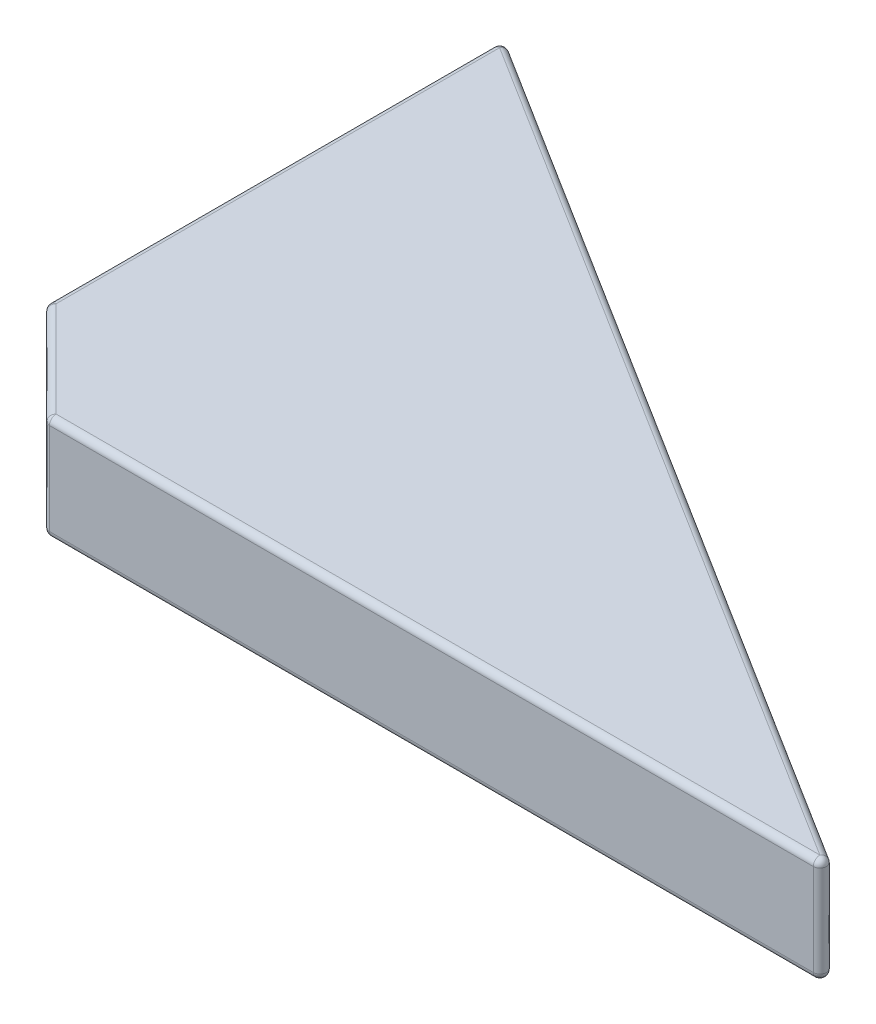
ISO-10303-21;
HEADER;
FILE_DESCRIPTION(('STEP AP214'),'2;1');
FILE_NAME('part.step','',(''),(''),'','','');
FILE_SCHEMA(('AUTOMOTIVE_DESIGN { 1 0 10303 214 1 1 1 1 }'));
ENDSEC;
DATA;
#1=APPLICATION_CONTEXT('core data for automotive mechanical design processes');
#2=APPLICATION_PROTOCOL_DEFINITION('international standard','automotive_design',2000,#1);
#3=PRODUCT_CONTEXT('',#1,'mechanical');
#4=PRODUCT('Part','Part','',(#3));
#5=PRODUCT_RELATED_PRODUCT_CATEGORY('part','',(#4));
#6=PRODUCT_DEFINITION_FORMATION('','',#4);
#7=PRODUCT_DEFINITION_CONTEXT('part definition',#1,'design');
#8=PRODUCT_DEFINITION('design','',#6,#7);
#9=PRODUCT_DEFINITION_SHAPE('','',#8);
#10=(LENGTH_UNIT() NAMED_UNIT(*) SI_UNIT(.MILLI.,.METRE.));
#11=(NAMED_UNIT(*) PLANE_ANGLE_UNIT() SI_UNIT($,.RADIAN.));
#12=(NAMED_UNIT(*) SI_UNIT($,.STERADIAN.) SOLID_ANGLE_UNIT());
#13=UNCERTAINTY_MEASURE_WITH_UNIT(LENGTH_MEASURE(1.E-05),#10,'distance_accuracy_value','');
#14=(GEOMETRIC_REPRESENTATION_CONTEXT(3) GLOBAL_UNCERTAINTY_ASSIGNED_CONTEXT((#13)) GLOBAL_UNIT_ASSIGNED_CONTEXT((#10,
#11,#12)) REPRESENTATION_CONTEXT('',''));
#15=CARTESIAN_POINT('',(0.,0.,0.));
#16=DIRECTION('',(0.,0.,1.));
#17=DIRECTION('',(1.,0.,0.));
#18=AXIS2_PLACEMENT_3D('',#15,#16,#17);
#19=CARTESIAN_POINT('',(3.17,0.,-6.17));
#20=DIRECTION('',(1.,0.,0.));
#21=DIRECTION('',(0.,0.,1.));
#22=AXIS2_PLACEMENT_3D('',#19,#20,#21);
#23=PLANE('',#22);
#24=DIRECTION('',(0.,-1.,0.));
#25=VECTOR('',#24,1.);
#26=CARTESIAN_POINT('',(3.17,0.,-6.25284271247463));
#27=LINE('',#26,#25);
#28=CARTESIAN_POINT('',(3.17,2.97,-6.25284271247463));
#29=VERTEX_POINT('',#28);
#30=CARTESIAN_POINT('',(3.17,0.2,-6.25284271247463));
#31=VERTEX_POINT('',#30);
#32=EDGE_CURVE('E200',#29,#31,#27,.T.);
#33=ORIENTED_EDGE('',*,*,#32,.F.);
#34=DIRECTION('',(0.,0.,1.));
#35=VECTOR('',#34,1.);
#36=CARTESIAN_POINT('',(3.17,2.97,-8.8775));
#37=LINE('',#36,#35);
#38=CARTESIAN_POINT('',(3.17,2.97,-19.638451589668));
#39=VERTEX_POINT('',#38);
#40=EDGE_CURVE('E253',#39,#29,#37,.T.);
#41=ORIENTED_EDGE('',*,*,#40,.F.);
#42=DIRECTION('',(0.,1.,0.));
#43=VECTOR('',#42,1.);
#44=CARTESIAN_POINT('',(3.17,0.,-19.638451589668));
#45=LINE('',#44,#43);
#46=CARTESIAN_POINT('',(3.17,0.2,-19.638451589668));
#47=VERTEX_POINT('',#46);
#48=EDGE_CURVE('E210',#47,#39,#45,.T.);
#49=ORIENTED_EDGE('',*,*,#48,.F.);
#50=DIRECTION('',(0.,0.,-1.));
#51=VECTOR('',#50,1.);
#52=CARTESIAN_POINT('',(3.17,0.2,-8.8775));
#53=LINE('',#52,#51);
#54=EDGE_CURVE('E246',#31,#47,#53,.T.);
#55=ORIENTED_EDGE('',*,*,#54,.F.);
#56=EDGE_LOOP('',(#33,#41,#49,#55));
#57=FACE_BOUND('',#56,.T.);
#58=ADVANCED_FACE('F16',(#57),#23,.F.);
#59=CARTESIAN_POINT('',(3.17,0.,-20.));
#60=DIRECTION('',(-0.531388898381452,0.,0.84712799427061));
#61=DIRECTION('',(0.,1.,0.));
#62=AXIS2_PLACEMENT_3D('',#59,#60,#61);
#63=PLANE('',#62);
#64=DIRECTION('',(0.,-1.,0.));
#65=VECTOR('',#64,1.);
#66=CARTESIAN_POINT('',(3.47627777967629,0.,-19.8078771885221));
#67=LINE('',#66,#65);
#68=CARTESIAN_POINT('',(3.47627777967629,2.97,-19.8078771885221));
#69=VERTEX_POINT('',#68);
#70=CARTESIAN_POINT('',(3.47627777967629,0.2,-19.8078771885221));
#71=VERTEX_POINT('',#70);
#72=EDGE_CURVE('E215',#69,#71,#67,.T.);
#73=ORIENTED_EDGE('',*,*,#72,.F.);
#74=DIRECTION('',(-0.84712799427061,0.,-0.531388898381452));
#75=VECTOR('',#74,1.);
#76=CARTESIAN_POINT('',(9.8775,2.97,-15.7925));
#77=LINE('',#76,#75);
#78=CARTESIAN_POINT('',(29.4110701831696,2.97,-3.53942559885412));
#79=VERTEX_POINT('',#78);
#80=EDGE_CURVE('E178',#79,#69,#77,.T.);
#81=ORIENTED_EDGE('',*,*,#80,.F.);
#82=DIRECTION('',(0.,1.,0.));
#83=VECTOR('',#82,1.);
#84=CARTESIAN_POINT('',(29.4110701831696,0.,-3.53942559885412));
#85=LINE('',#84,#83);
#86=CARTESIAN_POINT('',(29.4110701831696,0.2,-3.53942559885412));
#87=VERTEX_POINT('',#86);
#88=EDGE_CURVE('E206',#87,#79,#85,.T.);
#89=ORIENTED_EDGE('',*,*,#88,.F.);
#90=DIRECTION('',(0.84712799427061,0.,0.531388898381452));
#91=VECTOR('',#90,1.);
#92=CARTESIAN_POINT('',(9.8775,0.2,-15.7925));
#93=LINE('',#92,#91);
#94=EDGE_CURVE('E230',#71,#87,#93,.T.);
#95=ORIENTED_EDGE('',*,*,#94,.F.);
#96=EDGE_LOOP('',(#73,#81,#89,#95));
#97=FACE_BOUND('',#96,.T.);
#98=ADVANCED_FACE('F327',(#97),#63,.F.);
#99=CARTESIAN_POINT('',(16.585,3.17,-11.585));
#100=DIRECTION('',(0.,-1.,0.));
#101=DIRECTION('',(0.,0.,-1.));
#102=AXIS2_PLACEMENT_3D('',#99,#100,#101);
#103=PLANE('',#102);
#104=DIRECTION('',(-1.,0.,0.));
#105=VECTOR('',#104,1.);
#106=CARTESIAN_POINT('',(23.2925,3.17,-3.37));
#107=LINE('',#106,#105);
#108=CARTESIAN_POINT('',(29.3047924034933,3.17,-3.37));
#109=VERTEX_POINT('',#108);
#110=CARTESIAN_POINT('',(6.25284271247463,3.17,-3.37));
#111=VERTEX_POINT('',#110);
#112=EDGE_CURVE('E138',#109,#111,#107,.T.);
#113=ORIENTED_EDGE('',*,*,#112,.F.);
#114=DIRECTION('',(0.84712799427061,0.,0.531388898381452));
#115=VECTOR('',#114,1.);
#116=CARTESIAN_POINT('',(9.77122222032371,3.17,-15.6230744011459));
#117=LINE('',#116,#115);
#118=CARTESIAN_POINT('',(3.37,3.17,-19.638451589668));
#119=VERTEX_POINT('',#118);
#120=EDGE_CURVE('E175',#119,#109,#117,.T.);
#121=ORIENTED_EDGE('',*,*,#120,.F.);
#122=DIRECTION('',(0.,0.,-1.));
#123=VECTOR('',#122,1.);
#124=CARTESIAN_POINT('',(3.37,3.17,-8.8775));
#125=LINE('',#124,#123);
#126=CARTESIAN_POINT('',(3.37,3.17,-6.25284271247463));
#127=VERTEX_POINT('',#126);
#128=EDGE_CURVE('E256',#127,#119,#125,.T.);
#129=ORIENTED_EDGE('',*,*,#128,.F.);
#130=DIRECTION('',(-0.707106781186548,0.,-0.707106781186547));
#131=VECTOR('',#130,1.);
#132=CARTESIAN_POINT('',(6.81142135623732,3.17,-2.81142135623731));
#133=LINE('',#132,#131);
#134=EDGE_CURVE('E257',#111,#127,#133,.T.);
#135=ORIENTED_EDGE('',*,*,#134,.F.);
#136=EDGE_LOOP('',(#113,#121,#129,#135));
#137=FACE_BOUND('',#136,.T.);
#138=ADVANCED_FACE('F369',(#137),#103,.F.);
#139=CARTESIAN_POINT('',(30.,0.,-3.17));
#140=DIRECTION('',(0.,0.,-1.));
#141=DIRECTION('',(0.,-1.,0.));
#142=AXIS2_PLACEMENT_3D('',#139,#140,#141);
#143=PLANE('',#142);
#144=DIRECTION('',(0.,1.,0.));
#145=VECTOR('',#144,1.);
#146=CARTESIAN_POINT('',(6.25284271247463,0.,-3.17));
#147=LINE('',#146,#145);
#148=CARTESIAN_POINT('',(6.25284271247463,0.2,-3.17));
#149=VERTEX_POINT('',#148);
#150=CARTESIAN_POINT('',(6.25284271247463,2.97,-3.17));
#151=VERTEX_POINT('',#150);
#152=EDGE_CURVE('E130',#149,#151,#147,.T.);
#153=ORIENTED_EDGE('',*,*,#152,.F.);
#154=DIRECTION('',(-1.,0.,0.));
#155=VECTOR('',#154,1.);
#156=CARTESIAN_POINT('',(23.2925,0.2,-3.17));
#157=LINE('',#156,#155);
#158=CARTESIAN_POINT('',(29.3047924034933,0.2,-3.17));
#159=VERTEX_POINT('',#158);
#160=EDGE_CURVE('E27',#159,#149,#157,.T.);
#161=ORIENTED_EDGE('',*,*,#160,.F.);
#162=DIRECTION('',(0.,-1.,0.));
#163=VECTOR('',#162,1.);
#164=CARTESIAN_POINT('',(29.3047924034933,0.,-3.17));
#165=LINE('',#164,#163);
#166=CARTESIAN_POINT('',(29.3047924034933,2.97,-3.17));
#167=VERTEX_POINT('',#166);
#168=EDGE_CURVE('E132',#167,#159,#165,.T.);
#169=ORIENTED_EDGE('',*,*,#168,.F.);
#170=DIRECTION('',(1.,0.,0.));
#171=VECTOR('',#170,1.);
#172=CARTESIAN_POINT('',(23.2925,2.97,-3.17));
#173=LINE('',#172,#171);
#174=EDGE_CURVE('E126',#151,#167,#173,.T.);
#175=ORIENTED_EDGE('',*,*,#174,.F.);
#176=EDGE_LOOP('',(#153,#161,#169,#175));
#177=FACE_BOUND('',#176,.T.);
#178=ADVANCED_FACE('F128',(#177),#143,.F.);
#179=CARTESIAN_POINT('',(16.585,0.,-11.585));
#180=DIRECTION('',(0.,-1.,0.));
#181=DIRECTION('',(0.,0.,-1.));
#182=AXIS2_PLACEMENT_3D('',#179,#180,#181);
#183=PLANE('',#182);
#184=DIRECTION('',(0.707106781186548,0.,0.707106781186547));
#185=VECTOR('',#184,1.);
#186=CARTESIAN_POINT('',(6.81142135623732,0.,-2.81142135623731));
#187=LINE('',#186,#185);
#188=CARTESIAN_POINT('',(3.37,0.,-6.25284271247463));
#189=VERTEX_POINT('',#188);
#190=CARTESIAN_POINT('',(6.25284271247463,0.,-3.37));
#191=VERTEX_POINT('',#190);
#192=EDGE_CURVE('E182',#189,#191,#187,.T.);
#193=ORIENTED_EDGE('',*,*,#192,.F.);
#194=DIRECTION('',(0.,0.,1.));
#195=VECTOR('',#194,1.);
#196=CARTESIAN_POINT('',(3.37,0.,-8.8775));
#197=LINE('',#196,#195);
#198=CARTESIAN_POINT('',(3.37,0.,-19.638451589668));
#199=VERTEX_POINT('',#198);
#200=EDGE_CURVE('E20',#199,#189,#197,.T.);
#201=ORIENTED_EDGE('',*,*,#200,.F.);
#202=DIRECTION('',(-0.84712799427061,0.,-0.531388898381452));
#203=VECTOR('',#202,1.);
#204=CARTESIAN_POINT('',(9.77122222032371,0.,-15.6230744011459));
#205=LINE('',#204,#203);
#206=CARTESIAN_POINT('',(29.3047924034933,0.,-3.37));
#207=VERTEX_POINT('',#206);
#208=EDGE_CURVE('E237',#207,#199,#205,.T.);
#209=ORIENTED_EDGE('',*,*,#208,.F.);
#210=DIRECTION('',(1.,0.,0.));
#211=VECTOR('',#210,1.);
#212=CARTESIAN_POINT('',(23.2925,0.,-3.37));
#213=LINE('',#212,#211);
#214=EDGE_CURVE('E11',#191,#207,#213,.T.);
#215=ORIENTED_EDGE('',*,*,#214,.F.);
#216=EDGE_LOOP('',(#193,#201,#209,#215));
#217=FACE_BOUND('',#216,.T.);
#218=ADVANCED_FACE('F352',(#217),#183,.T.);
#219=CARTESIAN_POINT('',(6.17,0.,-3.17));
#220=DIRECTION('',(0.707106781186547,0.,-0.707106781186548));
#221=DIRECTION('',(0.,-1.,0.));
#222=AXIS2_PLACEMENT_3D('',#219,#220,#221);
#223=PLANE('',#222);
#224=DIRECTION('',(-0.707106781186548,0.,-0.707106781186547));
#225=VECTOR('',#224,1.);
#226=CARTESIAN_POINT('',(6.67,0.2,-2.67));
#227=LINE('',#226,#225);
#228=CARTESIAN_POINT('',(6.11142135623732,0.2,-3.22857864376269));
#229=VERTEX_POINT('',#228);
#230=CARTESIAN_POINT('',(3.22857864376269,0.2,-6.11142135623732));
#231=VERTEX_POINT('',#230);
#232=EDGE_CURVE('E170',#229,#231,#227,.T.);
#233=ORIENTED_EDGE('',*,*,#232,.F.);
#234=DIRECTION('',(0.,-1.,0.));
#235=VECTOR('',#234,1.);
#236=CARTESIAN_POINT('',(6.11142135623732,0.,-3.22857864376269));
#237=LINE('',#236,#235);
#238=CARTESIAN_POINT('',(6.11142135623732,2.97,-3.22857864376269));
#239=VERTEX_POINT('',#238);
#240=EDGE_CURVE('E151',#239,#229,#237,.T.);
#241=ORIENTED_EDGE('',*,*,#240,.F.);
#242=DIRECTION('',(0.707106781186548,0.,0.707106781186547));
#243=VECTOR('',#242,1.);
#244=CARTESIAN_POINT('',(6.67,2.97,-2.67));
#245=LINE('',#244,#243);
#246=CARTESIAN_POINT('',(3.22857864376269,2.97,-6.11142135623732));
#247=VERTEX_POINT('',#246);
#248=EDGE_CURVE('E41',#247,#239,#245,.T.);
#249=ORIENTED_EDGE('',*,*,#248,.F.);
#250=DIRECTION('',(0.,1.,0.));
#251=VECTOR('',#250,1.);
#252=CARTESIAN_POINT('',(3.22857864376269,0.,-6.11142135623732));
#253=LINE('',#252,#251);
#254=EDGE_CURVE('E197',#231,#247,#253,.T.);
#255=ORIENTED_EDGE('',*,*,#254,.F.);
#256=EDGE_LOOP('',(#233,#241,#249,#255));
#257=FACE_BOUND('',#256,.T.);
#258=ADVANCED_FACE('F395',(#257),#223,.F.);
#259=CARTESIAN_POINT('',(23.2925,0.2,-3.37));
#260=DIRECTION('',(1.,0.,0.));
#261=DIRECTION('',(0.,-0.707106781186547,0.707106781186548));
#262=AXIS2_PLACEMENT_3D('',#259,#260,#261);
#263=CYLINDRICAL_SURFACE('',#262,0.2);
#264=CARTESIAN_POINT('',(29.3047924034933,0.2,-3.37));
#265=DIRECTION('',(-1.,0.,0.));
#266=DIRECTION('',(0.,-1.,0.));
#267=AXIS2_PLACEMENT_3D('',#264,#265,#266);
#268=CIRCLE('',#267,0.2);
#269=EDGE_CURVE('E220',#207,#159,#268,.T.);
#270=ORIENTED_EDGE('',*,*,#269,.T.);
#271=ORIENTED_EDGE('',*,*,#160,.T.);
#272=CARTESIAN_POINT('',(6.25284271247463,0.2,-3.37));
#273=DIRECTION('',(1.,0.,0.));
#274=DIRECTION('',(0.,0.,1.));
#275=AXIS2_PLACEMENT_3D('',#272,#273,#274);
#276=CIRCLE('',#275,0.2);
#277=EDGE_CURVE('E174',#149,#191,#276,.T.);
#278=ORIENTED_EDGE('',*,*,#277,.T.);
#279=ORIENTED_EDGE('',*,*,#214,.T.);
#280=EDGE_LOOP('',(#270,#271,#278,#279));
#281=FACE_BOUND('',#280,.T.);
#282=ADVANCED_FACE('F18',(#281),#263,.T.);
#283=CARTESIAN_POINT('',(9.77122222032371,0.2,-15.6230744011459));
#284=DIRECTION('',(0.847127994270608,0.,0.531388898381456));
#285=DIRECTION('',(0.375748693492778,-0.707106781186549,-0.599009949281703));
#286=AXIS2_PLACEMENT_3D('',#283,#284,#285);
#287=CYLINDRICAL_SURFACE('',#286,0.2);
#288=CARTESIAN_POINT('',(29.3047924034933,0.2,-3.37));
#289=DIRECTION('',(-0.847127994270604,0.,-0.531388898381462));
#290=DIRECTION('',(0.531388898381462,0.,-0.847127994270604));
#291=AXIS2_PLACEMENT_3D('',#288,#289,#290);
#292=CIRCLE('',#291,0.2);
#293=EDGE_CURVE('E222',#87,#207,#292,.T.);
#294=ORIENTED_EDGE('',*,*,#293,.T.);
#295=ORIENTED_EDGE('',*,*,#208,.T.);
#296=CARTESIAN_POINT('',(3.37,0.2,-19.638451589668));
#297=DIRECTION('',(0.847127994270617,0.,0.531388898381442));
#298=DIRECTION('',(0.,-1.,0.));
#299=AXIS2_PLACEMENT_3D('',#296,#297,#298);
#300=CIRCLE('',#299,0.2);
#301=EDGE_CURVE('E205',#199,#71,#300,.T.);
#302=ORIENTED_EDGE('',*,*,#301,.T.);
#303=ORIENTED_EDGE('',*,*,#94,.T.);
#304=EDGE_LOOP('',(#294,#295,#302,#303));
#305=FACE_BOUND('',#304,.T.);
#306=ADVANCED_FACE('F329',(#305),#287,.T.);
#307=CARTESIAN_POINT('',(3.37,0.2,-8.8775));
#308=DIRECTION('',(0.,0.,-1.));
#309=DIRECTION('',(-0.707106781186548,-0.707106781186547,0.));
#310=AXIS2_PLACEMENT_3D('',#307,#308,#309);
#311=CYLINDRICAL_SURFACE('',#310,0.2);
#312=CARTESIAN_POINT('',(3.37,0.2,-19.638451589668));
#313=DIRECTION('',(0.,0.,1.));
#314=DIRECTION('',(-1.,0.,0.));
#315=AXIS2_PLACEMENT_3D('',#312,#313,#314);
#316=CIRCLE('',#315,0.2);
#317=EDGE_CURVE('E201',#47,#199,#316,.T.);
#318=ORIENTED_EDGE('',*,*,#317,.T.);
#319=ORIENTED_EDGE('',*,*,#200,.T.);
#320=CARTESIAN_POINT('',(3.37,0.2,-6.25284271247463));
#321=DIRECTION('',(0.,0.,-1.));
#322=DIRECTION('',(0.,-1.,0.));
#323=AXIS2_PLACEMENT_3D('',#320,#321,#322);
#324=CIRCLE('',#323,0.2);
#325=EDGE_CURVE('E196',#189,#31,#324,.T.);
#326=ORIENTED_EDGE('',*,*,#325,.T.);
#327=ORIENTED_EDGE('',*,*,#54,.T.);
#328=EDGE_LOOP('',(#318,#319,#326,#327));
#329=FACE_BOUND('',#328,.T.);
#330=ADVANCED_FACE('F348',(#329),#311,.T.);
#331=CARTESIAN_POINT('',(9.77122222032371,2.97,-15.6230744011459));
#332=DIRECTION('',(0.847127994270611,0.,0.531388898381451));
#333=DIRECTION('',(0.375748693492775,0.707106781186542,-0.599009949281713));
#334=AXIS2_PLACEMENT_3D('',#331,#332,#333);
#335=CYLINDRICAL_SURFACE('',#334,0.2);
#336=CARTESIAN_POINT('',(29.3047924034933,2.97,-3.37));
#337=DIRECTION('',(-0.847127994270614,0.,-0.531388898381447));
#338=DIRECTION('',(0.,1.,0.));
#339=AXIS2_PLACEMENT_3D('',#336,#337,#338);
#340=CIRCLE('',#339,0.2);
#341=EDGE_CURVE('E266',#109,#79,#340,.T.);
#342=ORIENTED_EDGE('',*,*,#341,.T.);
#343=ORIENTED_EDGE('',*,*,#80,.T.);
#344=CARTESIAN_POINT('',(3.37,2.97,-19.638451589668));
#345=DIRECTION('',(0.847127994270611,0.,0.53138889838145));
#346=DIRECTION('',(0.53138889838145,0.,-0.847127994270611));
#347=AXIS2_PLACEMENT_3D('',#344,#345,#346);
#348=CIRCLE('',#347,0.2);
#349=EDGE_CURVE('E189',#69,#119,#348,.T.);
#350=ORIENTED_EDGE('',*,*,#349,.T.);
#351=ORIENTED_EDGE('',*,*,#120,.T.);
#352=EDGE_LOOP('',(#342,#343,#350,#351));
#353=FACE_BOUND('',#352,.T.);
#354=ADVANCED_FACE('F322',(#353),#335,.T.);
#355=CARTESIAN_POINT('',(3.37,2.97,-8.8775));
#356=DIRECTION('',(0.,0.,-1.));
#357=DIRECTION('',(-0.707106781186548,0.707106781186548,0.));
#358=AXIS2_PLACEMENT_3D('',#355,#356,#357);
#359=CYLINDRICAL_SURFACE('',#358,0.2);
#360=CARTESIAN_POINT('',(3.37,2.97,-19.638451589668));
#361=DIRECTION('',(0.,0.,1.));
#362=DIRECTION('',(0.,1.,0.));
#363=AXIS2_PLACEMENT_3D('',#360,#361,#362);
#364=CIRCLE('',#363,0.2);
#365=EDGE_CURVE('E241',#119,#39,#364,.T.);
#366=ORIENTED_EDGE('',*,*,#365,.T.);
#367=ORIENTED_EDGE('',*,*,#40,.T.);
#368=CARTESIAN_POINT('',(3.37,2.97,-6.25284271247463));
#369=DIRECTION('',(0.,0.,-1.));
#370=DIRECTION('',(-1.,0.,0.));
#371=AXIS2_PLACEMENT_3D('',#368,#369,#370);
#372=CIRCLE('',#371,0.2);
#373=EDGE_CURVE('E214',#29,#127,#372,.T.);
#374=ORIENTED_EDGE('',*,*,#373,.T.);
#375=ORIENTED_EDGE('',*,*,#128,.T.);
#376=EDGE_LOOP('',(#366,#367,#374,#375));
#377=FACE_BOUND('',#376,.T.);
#378=ADVANCED_FACE('F367',(#377),#359,.T.);
#379=CARTESIAN_POINT('',(6.81142135623732,2.97,-2.81142135623731));
#380=DIRECTION('',(-0.707106781186549,0.,-0.707106781186546));
#381=DIRECTION('',(-0.5,0.70710678118655,0.5));
#382=AXIS2_PLACEMENT_3D('',#379,#380,#381);
#383=CYLINDRICAL_SURFACE('',#382,0.2);
#384=CARTESIAN_POINT('',(3.37,2.97,-6.25284271247463));
#385=DIRECTION('',(0.707106781186539,0.,0.707106781186556));
#386=DIRECTION('',(0.,1.,0.));
#387=AXIS2_PLACEMENT_3D('',#384,#385,#386);
#388=CIRCLE('',#387,0.2);
#389=EDGE_CURVE('E219',#127,#247,#388,.T.);
#390=ORIENTED_EDGE('',*,*,#389,.T.);
#391=ORIENTED_EDGE('',*,*,#248,.T.);
#392=CARTESIAN_POINT('',(6.25284271247463,2.97,-3.37));
#393=DIRECTION('',(-0.707106781186549,0.,-0.707106781186546));
#394=DIRECTION('',(-0.707106781186546,0.,0.707106781186549));
#395=AXIS2_PLACEMENT_3D('',#392,#393,#394);
#396=CIRCLE('',#395,0.2);
#397=EDGE_CURVE('E163',#239,#111,#396,.T.);
#398=ORIENTED_EDGE('',*,*,#397,.T.);
#399=ORIENTED_EDGE('',*,*,#134,.T.);
#400=EDGE_LOOP('',(#390,#391,#398,#399));
#401=FACE_BOUND('',#400,.T.);
#402=ADVANCED_FACE('F372',(#401),#383,.T.);
#403=CARTESIAN_POINT('',(3.37,0.,-6.25284271247463));
#404=DIRECTION('',(0.,1.,0.));
#405=DIRECTION('',(-0.923879532511286,0.,0.382683432365092));
#406=AXIS2_PLACEMENT_3D('',#403,#404,#405);
#407=CYLINDRICAL_SURFACE('',#406,0.2);
#408=CARTESIAN_POINT('',(3.37,2.97,-6.25284271247463));
#409=DIRECTION('',(0.,-1.,0.));
#410=DIRECTION('',(-0.707106781186546,0.,0.707106781186549));
#411=AXIS2_PLACEMENT_3D('',#408,#409,#410);
#412=CIRCLE('',#411,0.2);
#413=EDGE_CURVE('E234',#247,#29,#412,.T.);
#414=ORIENTED_EDGE('',*,*,#413,.T.);
#415=ORIENTED_EDGE('',*,*,#32,.T.);
#416=CARTESIAN_POINT('',(3.37,0.2,-6.25284271247463));
#417=DIRECTION('',(0.,1.,0.));
#418=DIRECTION('',(-1.,0.,0.));
#419=AXIS2_PLACEMENT_3D('',#416,#417,#418);
#420=CIRCLE('',#419,0.2);
#421=EDGE_CURVE('E195',#31,#231,#420,.T.);
#422=ORIENTED_EDGE('',*,*,#421,.T.);
#423=ORIENTED_EDGE('',*,*,#254,.T.);
#424=EDGE_LOOP('',(#414,#415,#422,#423));
#425=FACE_BOUND('',#424,.T.);
#426=ADVANCED_FACE('F361',(#425),#407,.T.);
#427=CARTESIAN_POINT('',(3.37,2.97,-6.25284271247463));
#428=DIRECTION('',(0.,0.,1.));
#429=DIRECTION('',(1.,0.,0.));
#430=AXIS2_PLACEMENT_3D('',#427,#428,#429);
#431=SPHERICAL_SURFACE('',#430,0.2);
#432=ORIENTED_EDGE('',*,*,#373,.F.);
#433=ORIENTED_EDGE('',*,*,#413,.F.);
#434=ORIENTED_EDGE('',*,*,#389,.F.);
#435=EDGE_LOOP('',(#432,#433,#434));
#436=FACE_BOUND('',#435,.T.);
#437=ADVANCED_FACE('F374',(#436),#431,.T.);
#438=CARTESIAN_POINT('',(3.37,0.,-19.638451589668));
#439=DIRECTION('',(0.,1.,0.));
#440=DIRECTION('',(-0.484051186145926,0.,-0.875039684351928));
#441=AXIS2_PLACEMENT_3D('',#438,#439,#440);
#442=CYLINDRICAL_SURFACE('',#441,0.2);
#443=CARTESIAN_POINT('',(3.37,2.97,-19.638451589668));
#444=DIRECTION('',(0.,-1.,0.));
#445=DIRECTION('',(-1.,0.,0.));
#446=AXIS2_PLACEMENT_3D('',#443,#444,#445);
#447=CIRCLE('',#446,0.2);
#448=EDGE_CURVE('E245',#39,#69,#447,.T.);
#449=ORIENTED_EDGE('',*,*,#448,.T.);
#450=ORIENTED_EDGE('',*,*,#72,.T.);
#451=CARTESIAN_POINT('',(3.37,0.2,-19.638451589668));
#452=DIRECTION('',(0.,1.,0.));
#453=DIRECTION('',(0.531388898381454,0.,-0.847127994270609));
#454=AXIS2_PLACEMENT_3D('',#451,#452,#453);
#455=CIRCLE('',#454,0.2);
#456=EDGE_CURVE('E187',#71,#47,#455,.T.);
#457=ORIENTED_EDGE('',*,*,#456,.T.);
#458=ORIENTED_EDGE('',*,*,#48,.T.);
#459=EDGE_LOOP('',(#449,#450,#457,#458));
#460=FACE_BOUND('',#459,.T.);
#461=ADVANCED_FACE('F314',(#460),#442,.T.);
#462=CARTESIAN_POINT('',(3.37,2.97,-19.638451589668));
#463=DIRECTION('',(-0.941617591148559,-0.256896727305536,0.217624409337027));
#464=DIRECTION('',(-0.336684291346631,0.718472716894131,-0.608638351600671));
#465=AXIS2_PLACEMENT_3D('',#462,#463,#464);
#466=SPHERICAL_SURFACE('',#465,0.2);
#467=ORIENTED_EDGE('',*,*,#349,.F.);
#468=ORIENTED_EDGE('',*,*,#448,.F.);
#469=ORIENTED_EDGE('',*,*,#365,.F.);
#470=EDGE_LOOP('',(#467,#468,#469));
#471=FACE_BOUND('',#470,.T.);
#472=ADVANCED_FACE('F320',(#471),#466,.T.);
#473=CARTESIAN_POINT('',(23.2925,2.97,-3.37));
#474=DIRECTION('',(-1.,0.,0.));
#475=DIRECTION('',(0.,0.707106781186548,0.707106781186548));
#476=AXIS2_PLACEMENT_3D('',#473,#474,#475);
#477=CYLINDRICAL_SURFACE('',#476,0.2);
#478=CARTESIAN_POINT('',(6.25284271247463,2.97,-3.37));
#479=DIRECTION('',(1.,0.,0.));
#480=DIRECTION('',(0.,1.,0.));
#481=AXIS2_PLACEMENT_3D('',#478,#479,#480);
#482=CIRCLE('',#481,0.2);
#483=EDGE_CURVE('E155',#111,#151,#482,.T.);
#484=ORIENTED_EDGE('',*,*,#483,.T.);
#485=ORIENTED_EDGE('',*,*,#174,.T.);
#486=CARTESIAN_POINT('',(29.3047924034933,2.97,-3.37));
#487=DIRECTION('',(-1.,0.,0.));
#488=DIRECTION('',(0.,0.,1.));
#489=AXIS2_PLACEMENT_3D('',#486,#487,#488);
#490=CIRCLE('',#489,0.2);
#491=EDGE_CURVE('E183',#167,#109,#490,.T.);
#492=ORIENTED_EDGE('',*,*,#491,.T.);
#493=ORIENTED_EDGE('',*,*,#112,.T.);
#494=EDGE_LOOP('',(#484,#485,#492,#493));
#495=FACE_BOUND('',#494,.T.);
#496=ADVANCED_FACE('F156',(#495),#477,.T.);
#497=CARTESIAN_POINT('',(6.25284271247463,0.,-3.37));
#498=DIRECTION('',(0.,1.,0.));
#499=DIRECTION('',(-0.382683432365089,0.,0.923879532511287));
#500=AXIS2_PLACEMENT_3D('',#497,#498,#499);
#501=CYLINDRICAL_SURFACE('',#500,0.2);
#502=CARTESIAN_POINT('',(6.25284271247463,2.97,-3.37));
#503=DIRECTION('',(0.,-1.,0.));
#504=DIRECTION('',(0.,0.,1.));
#505=AXIS2_PLACEMENT_3D('',#502,#503,#504);
#506=CIRCLE('',#505,0.2);
#507=EDGE_CURVE('E146',#151,#239,#506,.T.);
#508=ORIENTED_EDGE('',*,*,#507,.T.);
#509=ORIENTED_EDGE('',*,*,#240,.T.);
#510=CARTESIAN_POINT('',(6.25284271247463,0.2,-3.37));
#511=DIRECTION('',(0.,1.,0.));
#512=DIRECTION('',(-0.707106781186546,0.,0.707106781186549));
#513=AXIS2_PLACEMENT_3D('',#510,#511,#512);
#514=CIRCLE('',#513,0.2);
#515=EDGE_CURVE('E149',#229,#149,#514,.T.);
#516=ORIENTED_EDGE('',*,*,#515,.T.);
#517=ORIENTED_EDGE('',*,*,#152,.T.);
#518=EDGE_LOOP('',(#508,#509,#516,#517));
#519=FACE_BOUND('',#518,.T.);
#520=ADVANCED_FACE('F143',(#519),#501,.T.);
#521=CARTESIAN_POINT('',(6.25284271247463,2.97,-3.37));
#522=DIRECTION('',(-0.182143211721528,-0.879465224064612,0.4397326120323));
#523=DIRECTION('',(-0.33655677059078,0.475963149477963,0.812519920068747));
#524=AXIS2_PLACEMENT_3D('',#521,#522,#523);
#525=SPHERICAL_SURFACE('',#524,0.2);
#526=ORIENTED_EDGE('',*,*,#397,.F.);
#527=ORIENTED_EDGE('',*,*,#507,.F.);
#528=ORIENTED_EDGE('',*,*,#483,.F.);
#529=EDGE_LOOP('',(#526,#527,#528));
#530=FACE_BOUND('',#529,.T.);
#531=ADVANCED_FACE('F162',(#530),#525,.T.);
#532=CARTESIAN_POINT('',(6.81142135623732,0.2,-2.81142135623731));
#533=DIRECTION('',(-0.707106781186548,0.,-0.707106781186547));
#534=DIRECTION('',(-0.5,-0.707106781186546,0.5));
#535=AXIS2_PLACEMENT_3D('',#532,#533,#534);
#536=CYLINDRICAL_SURFACE('',#535,0.2);
#537=CARTESIAN_POINT('',(3.37,0.2,-6.25284271247463));
#538=DIRECTION('',(0.707106781186548,0.,0.707106781186548));
#539=DIRECTION('',(-0.707106781186548,0.,0.707106781186548));
#540=AXIS2_PLACEMENT_3D('',#537,#538,#539);
#541=CIRCLE('',#540,0.2);
#542=EDGE_CURVE('E191',#231,#189,#541,.T.);
#543=ORIENTED_EDGE('',*,*,#542,.T.);
#544=ORIENTED_EDGE('',*,*,#192,.T.);
#545=CARTESIAN_POINT('',(6.25284271247463,0.2,-3.37));
#546=DIRECTION('',(-0.707106781186546,0.,-0.707106781186549));
#547=DIRECTION('',(0.,-1.,0.));
#548=AXIS2_PLACEMENT_3D('',#545,#546,#547);
#549=CIRCLE('',#548,0.2);
#550=EDGE_CURVE('E225',#191,#229,#549,.T.);
#551=ORIENTED_EDGE('',*,*,#550,.T.);
#552=ORIENTED_EDGE('',*,*,#232,.T.);
#553=EDGE_LOOP('',(#543,#544,#551,#552));
#554=FACE_BOUND('',#553,.T.);
#555=ADVANCED_FACE('F355',(#554),#536,.T.);
#556=CARTESIAN_POINT('',(3.37,0.2,-6.25284271247463));
#557=DIRECTION('',(0.,0.,1.));
#558=DIRECTION('',(1.,0.,0.));
#559=AXIS2_PLACEMENT_3D('',#556,#557,#558);
#560=SPHERICAL_SURFACE('',#559,0.2);
#561=ORIENTED_EDGE('',*,*,#325,.F.);
#562=ORIENTED_EDGE('',*,*,#542,.F.);
#563=ORIENTED_EDGE('',*,*,#421,.F.);
#564=EDGE_LOOP('',(#561,#562,#563));
#565=FACE_BOUND('',#564,.T.);
#566=ADVANCED_FACE('F359',(#565),#560,.T.);
#567=CARTESIAN_POINT('',(29.3047924034933,0.,-3.37));
#568=DIRECTION('',(0.,1.,0.));
#569=DIRECTION('',(0.961022370777768,0.,0.276470618447382));
#570=AXIS2_PLACEMENT_3D('',#567,#568,#569);
#571=CYLINDRICAL_SURFACE('',#570,0.2);
#572=CARTESIAN_POINT('',(29.3047924034933,2.97,-3.37));
#573=DIRECTION('',(0.,-1.,0.));
#574=DIRECTION('',(0.53138889838146,0.,-0.847127994270605));
#575=AXIS2_PLACEMENT_3D('',#572,#573,#574);
#576=CIRCLE('',#575,0.200000000000003);
#577=EDGE_CURVE('E186',#79,#167,#576,.T.);
#578=ORIENTED_EDGE('',*,*,#577,.T.);
#579=ORIENTED_EDGE('',*,*,#168,.T.);
#580=CARTESIAN_POINT('',(29.3047924034933,0.2,-3.37));
#581=DIRECTION('',(0.,1.,0.));
#582=DIRECTION('',(0.,0.,1.));
#583=AXIS2_PLACEMENT_3D('',#580,#581,#582);
#584=CIRCLE('',#583,0.2);
#585=EDGE_CURVE('E226',#159,#87,#584,.T.);
#586=ORIENTED_EDGE('',*,*,#585,.T.);
#587=ORIENTED_EDGE('',*,*,#88,.T.);
#588=EDGE_LOOP('',(#578,#579,#586,#587));
#589=FACE_BOUND('',#588,.T.);
#590=ADVANCED_FACE('F410',(#589),#571,.T.);
#591=CARTESIAN_POINT('',(29.3047924034933,2.97,-3.37));
#592=DIRECTION('',(-0.88529352456642,0.459692212645535,0.0702740705653009));
#593=DIRECTION('',(0.465032660531233,0.875126789339486,0.133782387553843));
#594=AXIS2_PLACEMENT_3D('',#591,#592,#593);
#595=SPHERICAL_SURFACE('',#594,0.200000000000003);
#596=ORIENTED_EDGE('',*,*,#491,.F.);
#597=ORIENTED_EDGE('',*,*,#577,.F.);
#598=ORIENTED_EDGE('',*,*,#341,.F.);
#599=EDGE_LOOP('',(#596,#597,#598));
#600=FACE_BOUND('',#599,.T.);
#601=ADVANCED_FACE('F408',(#600),#595,.T.);
#602=CARTESIAN_POINT('',(3.37,0.2,-19.638451589668));
#603=DIRECTION('',(-0.941617591148556,0.256896727305547,0.217624409337026));
#604=DIRECTION('',(-0.336684291346638,-0.718472716894135,-0.608638351600663));
#605=AXIS2_PLACEMENT_3D('',#602,#603,#604);
#606=SPHERICAL_SURFACE('',#605,0.2);
#607=ORIENTED_EDGE('',*,*,#301,.F.);
#608=ORIENTED_EDGE('',*,*,#317,.F.);
#609=ORIENTED_EDGE('',*,*,#456,.F.);
#610=EDGE_LOOP('',(#607,#608,#609));
#611=FACE_BOUND('',#610,.T.);
#612=ADVANCED_FACE('F336',(#611),#606,.T.);
#613=CARTESIAN_POINT('',(6.25284271247463,0.2,-3.37));
#614=DIRECTION('',(0.182143211721528,-0.87946522406461,-0.439732612032305));
#615=DIRECTION('',(-0.336556770590777,-0.475963149477968,0.812519920068746));
#616=AXIS2_PLACEMENT_3D('',#613,#614,#615);
#617=SPHERICAL_SURFACE('',#616,0.2);
#618=ORIENTED_EDGE('',*,*,#515,.F.);
#619=ORIENTED_EDGE('',*,*,#550,.F.);
#620=ORIENTED_EDGE('',*,*,#277,.F.);
#621=EDGE_LOOP('',(#618,#619,#620));
#622=FACE_BOUND('',#621,.T.);
#623=ADVANCED_FACE('F413',(#622),#617,.T.);
#624=CARTESIAN_POINT('',(29.3047924034933,0.2,-3.37));
#625=DIRECTION('',(-0.885293524566431,-0.459692212645515,0.0702740705652959));
#626=DIRECTION('',(0.465032660531218,-0.875126789339494,0.133782387553841));
#627=AXIS2_PLACEMENT_3D('',#624,#625,#626);
#628=SPHERICAL_SURFACE('',#627,0.2);
#629=ORIENTED_EDGE('',*,*,#269,.F.);
#630=ORIENTED_EDGE('',*,*,#293,.F.);
#631=ORIENTED_EDGE('',*,*,#585,.F.);
#632=EDGE_LOOP('',(#629,#630,#631));
#633=FACE_BOUND('',#632,.T.);
#634=ADVANCED_FACE('F416',(#633),#628,.T.);
#635=CLOSED_SHELL('',(#58,#98,#138,#178,#218,#258,#282,#306,#330,#354,#378,#402,#426,#437,#461,
#472,#496,#520,#531,#555,#566,#590,#601,#612,#623,#634));
#636=MANIFOLD_SOLID_BREP('B1',#635);
#637=ADVANCED_BREP_SHAPE_REPRESENTATION('',(#18,#636),#14);
#638=SHAPE_DEFINITION_REPRESENTATION(#9,#637);
ENDSEC;
END-ISO-10303-21;
